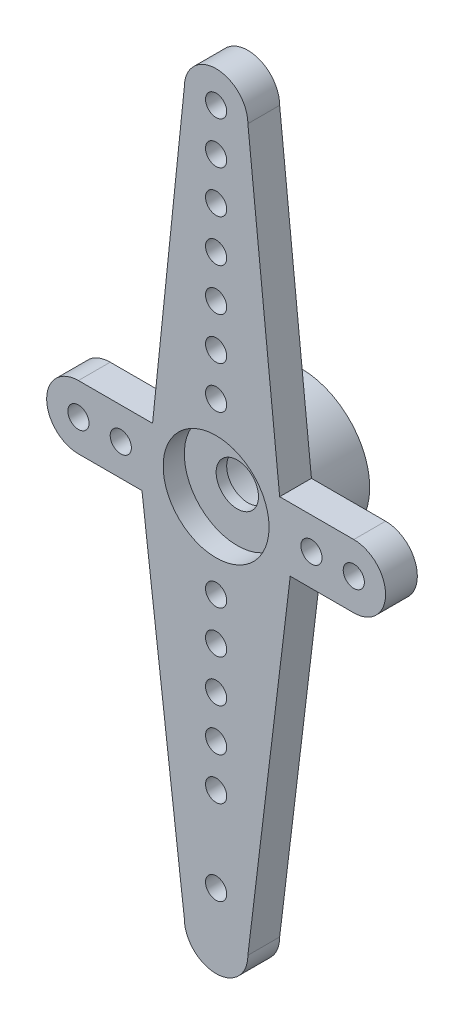
ISO-10303-21;
HEADER;
FILE_DESCRIPTION(('STEP AP214'),'2;1');
FILE_NAME('part.step','',(''),(''),'','','');
FILE_SCHEMA(('AUTOMOTIVE_DESIGN { 1 0 10303 214 1 1 1 1 }'));
ENDSEC;
DATA;
#1=APPLICATION_CONTEXT('core data for automotive mechanical design processes');
#2=APPLICATION_PROTOCOL_DEFINITION('international standard','automotive_design',2000,#1);
#3=PRODUCT_CONTEXT('',#1,'mechanical');
#4=PRODUCT('Part','Part','',(#3));
#5=PRODUCT_RELATED_PRODUCT_CATEGORY('part','',(#4));
#6=PRODUCT_DEFINITION_FORMATION('','',#4);
#7=PRODUCT_DEFINITION_CONTEXT('part definition',#1,'design');
#8=PRODUCT_DEFINITION('design','',#6,#7);
#9=PRODUCT_DEFINITION_SHAPE('','',#8);
#10=(LENGTH_UNIT() NAMED_UNIT(*) SI_UNIT(.MILLI.,.METRE.));
#11=(NAMED_UNIT(*) PLANE_ANGLE_UNIT() SI_UNIT($,.RADIAN.));
#12=(NAMED_UNIT(*) SI_UNIT($,.STERADIAN.) SOLID_ANGLE_UNIT());
#13=UNCERTAINTY_MEASURE_WITH_UNIT(LENGTH_MEASURE(1.E-05),#10,'distance_accuracy_value','');
#14=(GEOMETRIC_REPRESENTATION_CONTEXT(3) GLOBAL_UNCERTAINTY_ASSIGNED_CONTEXT((#13)) GLOBAL_UNIT_ASSIGNED_CONTEXT((#10,
#11,#12)) REPRESENTATION_CONTEXT('',''));
#15=CARTESIAN_POINT('',(0.,0.,0.));
#16=DIRECTION('',(0.,0.,1.));
#17=DIRECTION('',(1.,0.,0.));
#18=AXIS2_PLACEMENT_3D('',#15,#16,#17);
#19=CARTESIAN_POINT('',(0.,0.,1.5));
#20=DIRECTION('',(0.,0.,-1.));
#21=DIRECTION('',(-1.,0.,0.));
#22=AXIS2_PLACEMENT_3D('',#19,#20,#21);
#23=CYLINDRICAL_SURFACE('',#22,1.);
#24=CARTESIAN_POINT('',(0.,0.,0.));
#25=DIRECTION('',(0.,0.,1.));
#26=DIRECTION('',(1.,0.,0.));
#27=AXIS2_PLACEMENT_3D('',#24,#25,#26);
#28=CIRCLE('',#27,1.);
#29=CARTESIAN_POINT('',(1.,0.,0.));
#30=VERTEX_POINT('',#29);
#31=EDGE_CURVE('E728',#30,#30,#28,.T.);
#32=ORIENTED_EDGE('',*,*,#31,.F.);
#33=EDGE_LOOP('',(#32));
#34=FACE_BOUND('',#33,.T.);
#35=CARTESIAN_POINT('',(0.,0.,0.5));
#36=DIRECTION('',(0.,0.,1.));
#37=DIRECTION('',(1.,0.,0.));
#38=AXIS2_PLACEMENT_3D('',#35,#36,#37);
#39=CIRCLE('',#38,1.);
#40=CARTESIAN_POINT('',(1.,0.,0.5));
#41=VERTEX_POINT('',#40);
#42=EDGE_CURVE('E39',#41,#41,#39,.T.);
#43=ORIENTED_EDGE('',*,*,#42,.T.);
#44=EDGE_LOOP('',(#43));
#45=FACE_BOUND('',#44,.T.);
#46=ADVANCED_FACE('F35',(#34,#45),#23,.F.);
#47=CARTESIAN_POINT('',(0.,16.,0.));
#48=DIRECTION('',(0.,0.,1.));
#49=DIRECTION('',(1.,0.,0.));
#50=AXIS2_PLACEMENT_3D('',#47,#48,#49);
#51=PLANE('',#50);
#52=ORIENTED_EDGE('',*,*,#31,.T.);
#53=EDGE_LOOP('',(#52));
#54=FACE_BOUND('',#53,.T.);
#55=CARTESIAN_POINT('',(0.,0.,0.));
#56=DIRECTION('',(0.,0.,-1.));
#57=DIRECTION('',(-1.,0.,0.));
#58=AXIS2_PLACEMENT_3D('',#55,#56,#57);
#59=CIRCLE('',#58,2.);
#60=CARTESIAN_POINT('',(-2.,0.,0.));
#61=VERTEX_POINT('',#60);
#62=EDGE_CURVE('E622',#61,#61,#59,.T.);
#63=ORIENTED_EDGE('',*,*,#62,.T.);
#64=EDGE_LOOP('',(#63));
#65=FACE_BOUND('',#64,.T.);
#66=ADVANCED_FACE('F270',(#54,#65),#51,.F.);
#67=CARTESIAN_POINT('',(0.,16.,1.5));
#68=DIRECTION('',(0.,0.,1.));
#69=DIRECTION('',(1.,0.,0.));
#70=AXIS2_PLACEMENT_3D('',#67,#68,#69);
#71=PLANE('',#70);
#72=CARTESIAN_POINT('',(0.,0.,1.5));
#73=DIRECTION('',(0.,0.,1.));
#74=DIRECTION('',(1.,0.,0.));
#75=AXIS2_PLACEMENT_3D('',#72,#73,#74);
#76=CIRCLE('',#75,2.5);
#77=CARTESIAN_POINT('',(2.5,0.,1.5));
#78=VERTEX_POINT('',#77);
#79=EDGE_CURVE('E620',#78,#78,#76,.T.);
#80=ORIENTED_EDGE('',*,*,#79,.F.);
#81=EDGE_LOOP('',(#80));
#82=FACE_BOUND('',#81,.T.);
#83=CARTESIAN_POINT('',(0.,-10.,1.5));
#84=DIRECTION('',(0.,0.,1.));
#85=DIRECTION('',(-1.,0.,0.));
#86=AXIS2_PLACEMENT_3D('',#83,#84,#85);
#87=CIRCLE('',#86,0.5);
#88=CARTESIAN_POINT('',(-0.499999999999937,-10.,1.5));
#89=VERTEX_POINT('',#88);
#90=EDGE_CURVE('E641',#89,#89,#87,.T.);
#91=ORIENTED_EDGE('',*,*,#90,.F.);
#92=EDGE_LOOP('',(#91));
#93=FACE_BOUND('',#92,.T.);
#94=CARTESIAN_POINT('',(1.04744440165294E-13,-6.,1.5));
#95=DIRECTION('',(0.,0.,1.));
#96=DIRECTION('',(-1.,0.,0.));
#97=AXIS2_PLACEMENT_3D('',#94,#95,#96);
#98=CIRCLE('',#97,0.5);
#99=CARTESIAN_POINT('',(-0.499999999999895,-6.,1.5));
#100=VERTEX_POINT('',#99);
#101=EDGE_CURVE('E653',#100,#100,#98,.T.);
#102=ORIENTED_EDGE('',*,*,#101,.F.);
#103=EDGE_LOOP('',(#102));
#104=FACE_BOUND('',#103,.T.);
#105=CARTESIAN_POINT('',(0.,-16.,1.5));
#106=DIRECTION('',(0.,0.,1.));
#107=DIRECTION('',(-1.,0.,0.));
#108=AXIS2_PLACEMENT_3D('',#105,#106,#107);
#109=CIRCLE('',#108,0.5);
#110=CARTESIAN_POINT('',(-0.5,-16.,1.5));
#111=VERTEX_POINT('',#110);
#112=EDGE_CURVE('E665',#111,#111,#109,.T.);
#113=ORIENTED_EDGE('',*,*,#112,.F.);
#114=EDGE_LOOP('',(#113));
#115=FACE_BOUND('',#114,.T.);
#116=CARTESIAN_POINT('',(1.04744440165294E-13,6.,1.5));
#117=DIRECTION('',(0.,0.,1.));
#118=DIRECTION('',(1.,0.,0.));
#119=AXIS2_PLACEMENT_3D('',#116,#117,#118);
#120=CIRCLE('',#119,0.5);
#121=CARTESIAN_POINT('',(0.500000000000105,6.,1.5));
#122=VERTEX_POINT('',#121);
#123=EDGE_CURVE('E677',#122,#122,#120,.T.);
#124=ORIENTED_EDGE('',*,*,#123,.F.);
#125=EDGE_LOOP('',(#124));
#126=FACE_BOUND('',#125,.T.);
#127=CARTESIAN_POINT('',(0.,10.,1.5));
#128=DIRECTION('',(0.,0.,1.));
#129=DIRECTION('',(1.,0.,0.));
#130=AXIS2_PLACEMENT_3D('',#127,#128,#129);
#131=CIRCLE('',#130,0.5);
#132=CARTESIAN_POINT('',(0.500000000000063,10.,1.5));
#133=VERTEX_POINT('',#132);
#134=EDGE_CURVE('E689',#133,#133,#131,.T.);
#135=ORIENTED_EDGE('',*,*,#134,.F.);
#136=EDGE_LOOP('',(#135));
#137=FACE_BOUND('',#136,.T.);
#138=CARTESIAN_POINT('',(0.,14.,1.5));
#139=DIRECTION('',(0.,0.,1.));
#140=DIRECTION('',(1.,0.,0.));
#141=AXIS2_PLACEMENT_3D('',#138,#139,#140);
#142=CIRCLE('',#141,0.5);
#143=CARTESIAN_POINT('',(0.500000000000021,14.,1.5));
#144=VERTEX_POINT('',#143);
#145=EDGE_CURVE('E701',#144,#144,#142,.T.);
#146=ORIENTED_EDGE('',*,*,#145,.F.);
#147=EDGE_LOOP('',(#146));
#148=FACE_BOUND('',#147,.T.);
#149=CARTESIAN_POINT('',(6.5,0.,1.5));
#150=DIRECTION('',(0.,0.,1.));
#151=DIRECTION('',(-1.,0.,0.));
#152=AXIS2_PLACEMENT_3D('',#149,#150,#151);
#153=CIRCLE('',#152,0.500000000000002);
#154=CARTESIAN_POINT('',(6.,0.,1.5));
#155=VERTEX_POINT('',#154);
#156=EDGE_CURVE('E713',#155,#155,#153,.T.);
#157=ORIENTED_EDGE('',*,*,#156,.F.);
#158=EDGE_LOOP('',(#157));
#159=FACE_BOUND('',#158,.T.);
#160=CARTESIAN_POINT('',(-4.5,0.,1.5));
#161=DIRECTION('',(0.,0.,1.));
#162=DIRECTION('',(1.,0.,0.));
#163=AXIS2_PLACEMENT_3D('',#160,#161,#162);
#164=CIRCLE('',#163,0.500000000000001);
#165=CARTESIAN_POINT('',(-4.,0.,1.5));
#166=VERTEX_POINT('',#165);
#167=EDGE_CURVE('E725',#166,#166,#164,.T.);
#168=ORIENTED_EDGE('',*,*,#167,.F.);
#169=EDGE_LOOP('',(#168));
#170=FACE_BOUND('',#169,.T.);
#171=CARTESIAN_POINT('',(-6.5,0.,1.5));
#172=DIRECTION('',(0.,0.,1.));
#173=DIRECTION('',(1.,0.,0.));
#174=AXIS2_PLACEMENT_3D('',#171,#172,#173);
#175=CIRCLE('',#174,0.500000000000001);
#176=CARTESIAN_POINT('',(-6.,0.,1.5));
#177=VERTEX_POINT('',#176);
#178=EDGE_CURVE('E163',#177,#177,#175,.T.);
#179=ORIENTED_EDGE('',*,*,#178,.F.);
#180=EDGE_LOOP('',(#179));
#181=FACE_BOUND('',#180,.T.);
#182=CARTESIAN_POINT('',(0.,16.,1.5));
#183=DIRECTION('',(0.,0.,1.));
#184=DIRECTION('',(1.,0.,0.));
#185=AXIS2_PLACEMENT_3D('',#182,#183,#184);
#186=CIRCLE('',#185,1.5);
#187=CARTESIAN_POINT('',(1.5,16.,1.5));
#188=VERTEX_POINT('',#187);
#189=CARTESIAN_POINT('',(-1.5,16.,1.5));
#190=VERTEX_POINT('',#189);
#191=EDGE_CURVE('E182',#188,#190,#186,.T.);
#192=ORIENTED_EDGE('',*,*,#191,.T.);
#193=DIRECTION('',(-0.102899151085505,-0.994691793826551,0.));
#194=VECTOR('',#193,1.);
#195=CARTESIAN_POINT('',(-1.5,16.,1.5));
#196=LINE('',#195,#194);
#197=CARTESIAN_POINT('',(-3.,1.5,1.5));
#198=VERTEX_POINT('',#197);
#199=EDGE_CURVE('E109',#190,#198,#196,.T.);
#200=ORIENTED_EDGE('',*,*,#199,.T.);
#201=DIRECTION('',(-1.,0.,0.));
#202=VECTOR('',#201,1.);
#203=CARTESIAN_POINT('',(-3.,1.5,1.5));
#204=LINE('',#203,#202);
#205=CARTESIAN_POINT('',(-6.5,1.5,1.5));
#206=VERTEX_POINT('',#205);
#207=EDGE_CURVE('E229',#198,#206,#204,.T.);
#208=ORIENTED_EDGE('',*,*,#207,.T.);
#209=CARTESIAN_POINT('',(-6.5,0.,1.5));
#210=DIRECTION('',(0.,0.,1.));
#211=DIRECTION('',(-1.,0.,0.));
#212=AXIS2_PLACEMENT_3D('',#209,#210,#211);
#213=CIRCLE('',#212,1.5);
#214=CARTESIAN_POINT('',(-6.5,-1.5,1.5));
#215=VERTEX_POINT('',#214);
#216=EDGE_CURVE('E226',#206,#215,#213,.T.);
#217=ORIENTED_EDGE('',*,*,#216,.T.);
#218=DIRECTION('',(1.,0.,0.));
#219=VECTOR('',#218,1.);
#220=CARTESIAN_POINT('',(-6.5,-1.5,1.5));
#221=LINE('',#220,#219);
#222=CARTESIAN_POINT('',(-3.5,-1.5,1.5));
#223=VERTEX_POINT('',#222);
#224=EDGE_CURVE('E228',#215,#223,#221,.T.);
#225=ORIENTED_EDGE('',*,*,#224,.T.);
#226=DIRECTION('',(0.120331367519237,-0.992733782033708,0.));
#227=VECTOR('',#226,1.);
#228=CARTESIAN_POINT('',(-3.5,-1.5,1.5));
#229=LINE('',#228,#227);
#230=CARTESIAN_POINT('',(-1.5,-18.,1.5));
#231=VERTEX_POINT('',#230);
#232=EDGE_CURVE('E231',#223,#231,#229,.T.);
#233=ORIENTED_EDGE('',*,*,#232,.T.);
#234=CARTESIAN_POINT('',(0.,-18.,1.5));
#235=DIRECTION('',(0.,0.,1.));
#236=DIRECTION('',(1.,0.,0.));
#237=AXIS2_PLACEMENT_3D('',#234,#235,#236);
#238=CIRCLE('',#237,1.5);
#239=CARTESIAN_POINT('',(1.5,-18.,1.5));
#240=VERTEX_POINT('',#239);
#241=EDGE_CURVE('E237',#231,#240,#238,.T.);
#242=ORIENTED_EDGE('',*,*,#241,.T.);
#243=DIRECTION('',(0.120331367519237,0.992733782033708,0.));
#244=VECTOR('',#243,1.);
#245=CARTESIAN_POINT('',(3.5,-1.5,1.5));
#246=LINE('',#245,#244);
#247=CARTESIAN_POINT('',(3.5,-1.5,1.5));
#248=VERTEX_POINT('',#247);
#249=EDGE_CURVE('E239',#240,#248,#246,.T.);
#250=ORIENTED_EDGE('',*,*,#249,.T.);
#251=DIRECTION('',(1.,0.,0.));
#252=VECTOR('',#251,1.);
#253=CARTESIAN_POINT('',(6.5,-1.5,1.5));
#254=LINE('',#253,#252);
#255=CARTESIAN_POINT('',(6.5,-1.5,1.5));
#256=VERTEX_POINT('',#255);
#257=EDGE_CURVE('E141',#248,#256,#254,.T.);
#258=ORIENTED_EDGE('',*,*,#257,.T.);
#259=CARTESIAN_POINT('',(6.5,0.,1.5));
#260=DIRECTION('',(0.,0.,1.));
#261=DIRECTION('',(1.,0.,0.));
#262=AXIS2_PLACEMENT_3D('',#259,#260,#261);
#263=CIRCLE('',#262,1.5);
#264=CARTESIAN_POINT('',(6.5,1.5,1.5));
#265=VERTEX_POINT('',#264);
#266=EDGE_CURVE('E134',#256,#265,#263,.T.);
#267=ORIENTED_EDGE('',*,*,#266,.T.);
#268=DIRECTION('',(-1.,0.,0.));
#269=VECTOR('',#268,1.);
#270=CARTESIAN_POINT('',(3.,1.5,1.5));
#271=LINE('',#270,#269);
#272=CARTESIAN_POINT('',(3.,1.5,1.5));
#273=VERTEX_POINT('',#272);
#274=EDGE_CURVE('E139',#265,#273,#271,.T.);
#275=ORIENTED_EDGE('',*,*,#274,.T.);
#276=DIRECTION('',(-0.102899151085505,0.994691793826551,0.));
#277=VECTOR('',#276,1.);
#278=CARTESIAN_POINT('',(1.5,16.,1.5));
#279=LINE('',#278,#277);
#280=EDGE_CURVE('E53',#273,#188,#279,.T.);
#281=ORIENTED_EDGE('',*,*,#280,.T.);
#282=EDGE_LOOP('',(#192,#200,#208,#217,#225,#233,#242,#250,#258,#267,#275,#281));
#283=FACE_BOUND('',#282,.T.);
#284=CARTESIAN_POINT('',(4.5,0.,1.5));
#285=DIRECTION('',(0.,0.,1.));
#286=DIRECTION('',(-1.,0.,0.));
#287=AXIS2_PLACEMENT_3D('',#284,#285,#286);
#288=CIRCLE('',#287,0.500000000000001);
#289=CARTESIAN_POINT('',(4.,0.,1.5));
#290=VERTEX_POINT('',#289);
#291=EDGE_CURVE('E719',#290,#290,#288,.T.);
#292=ORIENTED_EDGE('',*,*,#291,.F.);
#293=EDGE_LOOP('',(#292));
#294=FACE_BOUND('',#293,.T.);
#295=CARTESIAN_POINT('',(0.,16.,1.5));
#296=DIRECTION('',(0.,0.,1.));
#297=DIRECTION('',(1.,0.,0.));
#298=AXIS2_PLACEMENT_3D('',#295,#296,#297);
#299=CIRCLE('',#298,0.5);
#300=CARTESIAN_POINT('',(0.5,16.,1.5));
#301=VERTEX_POINT('',#300);
#302=EDGE_CURVE('E707',#301,#301,#299,.T.);
#303=ORIENTED_EDGE('',*,*,#302,.F.);
#304=EDGE_LOOP('',(#303));
#305=FACE_BOUND('',#304,.T.);
#306=CARTESIAN_POINT('',(0.,12.,1.5));
#307=DIRECTION('',(0.,0.,1.));
#308=DIRECTION('',(1.,0.,0.));
#309=AXIS2_PLACEMENT_3D('',#306,#307,#308);
#310=CIRCLE('',#309,0.5);
#311=CARTESIAN_POINT('',(0.500000000000042,12.,1.5));
#312=VERTEX_POINT('',#311);
#313=EDGE_CURVE('E695',#312,#312,#310,.T.);
#314=ORIENTED_EDGE('',*,*,#313,.F.);
#315=EDGE_LOOP('',(#314));
#316=FACE_BOUND('',#315,.T.);
#317=CARTESIAN_POINT('',(0.,8.,1.5));
#318=DIRECTION('',(0.,0.,1.));
#319=DIRECTION('',(1.,0.,0.));
#320=AXIS2_PLACEMENT_3D('',#317,#318,#319);
#321=CIRCLE('',#320,0.5);
#322=CARTESIAN_POINT('',(0.500000000000084,8.,1.5));
#323=VERTEX_POINT('',#322);
#324=EDGE_CURVE('E683',#323,#323,#321,.T.);
#325=ORIENTED_EDGE('',*,*,#324,.F.);
#326=EDGE_LOOP('',(#325));
#327=FACE_BOUND('',#326,.T.);
#328=CARTESIAN_POINT('',(1.25693328198353E-13,4.,1.5));
#329=DIRECTION('',(0.,0.,1.));
#330=DIRECTION('',(1.,0.,0.));
#331=AXIS2_PLACEMENT_3D('',#328,#329,#330);
#332=CIRCLE('',#331,0.5);
#333=CARTESIAN_POINT('',(0.500000000000126,4.,1.5));
#334=VERTEX_POINT('',#333);
#335=EDGE_CURVE('E671',#334,#334,#332,.T.);
#336=ORIENTED_EDGE('',*,*,#335,.F.);
#337=EDGE_LOOP('',(#336));
#338=FACE_BOUND('',#337,.T.);
#339=CARTESIAN_POINT('',(1.25693328198353E-13,-4.,1.5));
#340=DIRECTION('',(0.,0.,1.));
#341=DIRECTION('',(-1.,0.,0.));
#342=AXIS2_PLACEMENT_3D('',#339,#340,#341);
#343=CIRCLE('',#342,0.5);
#344=CARTESIAN_POINT('',(-0.499999999999874,-4.,1.5));
#345=VERTEX_POINT('',#344);
#346=EDGE_CURVE('E659',#345,#345,#343,.T.);
#347=ORIENTED_EDGE('',*,*,#346,.F.);
#348=EDGE_LOOP('',(#347));
#349=FACE_BOUND('',#348,.T.);
#350=CARTESIAN_POINT('',(0.,-8.,1.5));
#351=DIRECTION('',(0.,0.,1.));
#352=DIRECTION('',(-1.,0.,0.));
#353=AXIS2_PLACEMENT_3D('',#350,#351,#352);
#354=CIRCLE('',#353,0.5);
#355=CARTESIAN_POINT('',(-0.499999999999916,-8.,1.5));
#356=VERTEX_POINT('',#355);
#357=EDGE_CURVE('E647',#356,#356,#354,.T.);
#358=ORIENTED_EDGE('',*,*,#357,.F.);
#359=EDGE_LOOP('',(#358));
#360=FACE_BOUND('',#359,.T.);
#361=CARTESIAN_POINT('',(0.,-12.,1.5));
#362=DIRECTION('',(0.,0.,1.));
#363=DIRECTION('',(-1.,0.,0.));
#364=AXIS2_PLACEMENT_3D('',#361,#362,#363);
#365=CIRCLE('',#364,0.5);
#366=CARTESIAN_POINT('',(-0.499999999999958,-12.,1.5));
#367=VERTEX_POINT('',#366);
#368=EDGE_CURVE('E635',#367,#367,#365,.T.);
#369=ORIENTED_EDGE('',*,*,#368,.F.);
#370=EDGE_LOOP('',(#369));
#371=FACE_BOUND('',#370,.T.);
#372=ADVANCED_FACE('F136',(#82,#93,#104,#115,#126,#137,#148,#159,#170,#181,#283,#294,#305,#316,
#327,#338,#349,#360,#371),#71,.T.);
#373=CARTESIAN_POINT('',(0.,0.,0.));
#374=DIRECTION('',(0.,0.,1.));
#375=DIRECTION('',(1.,0.,0.));
#376=AXIS2_PLACEMENT_3D('',#373,#374,#375);
#377=CIRCLE('',#376,3.25);
#378=CARTESIAN_POINT('',(3.25,0.,0.));
#379=VERTEX_POINT('',#378);
#380=EDGE_CURVE('E11',#379,#379,#377,.F.);
#381=ORIENTED_EDGE('',*,*,#380,.F.);
#382=EDGE_LOOP('',(#381));
#383=FACE_BOUND('',#382,.T.);
#384=CARTESIAN_POINT('',(0.,16.,0.));
#385=DIRECTION('',(0.,0.,1.));
#386=DIRECTION('',(1.,0.,0.));
#387=AXIS2_PLACEMENT_3D('',#384,#385,#386);
#388=CIRCLE('',#387,1.5);
#389=CARTESIAN_POINT('',(1.5,16.,0.));
#390=VERTEX_POINT('',#389);
#391=CARTESIAN_POINT('',(-1.5,16.,0.));
#392=VERTEX_POINT('',#391);
#393=EDGE_CURVE('E159',#390,#392,#388,.T.);
#394=ORIENTED_EDGE('',*,*,#393,.F.);
#395=DIRECTION('',(-0.102899151085505,0.994691793826551,0.));
#396=VECTOR('',#395,1.);
#397=CARTESIAN_POINT('',(1.5,16.,0.));
#398=LINE('',#397,#396);
#399=CARTESIAN_POINT('',(3.,1.5,0.));
#400=VERTEX_POINT('',#399);
#401=EDGE_CURVE('E100',#400,#390,#398,.T.);
#402=ORIENTED_EDGE('',*,*,#401,.F.);
#403=DIRECTION('',(-1.,0.,0.));
#404=VECTOR('',#403,1.);
#405=CARTESIAN_POINT('',(3.,1.5,0.));
#406=LINE('',#405,#404);
#407=CARTESIAN_POINT('',(6.5,1.5,0.));
#408=VERTEX_POINT('',#407);
#409=EDGE_CURVE('E94',#408,#400,#406,.T.);
#410=ORIENTED_EDGE('',*,*,#409,.F.);
#411=CARTESIAN_POINT('',(6.5,0.,0.));
#412=DIRECTION('',(0.,0.,1.));
#413=DIRECTION('',(1.,0.,0.));
#414=AXIS2_PLACEMENT_3D('',#411,#412,#413);
#415=CIRCLE('',#414,1.5);
#416=CARTESIAN_POINT('',(6.5,-1.5,0.));
#417=VERTEX_POINT('',#416);
#418=EDGE_CURVE('E149',#417,#408,#415,.T.);
#419=ORIENTED_EDGE('',*,*,#418,.F.);
#420=DIRECTION('',(1.,0.,0.));
#421=VECTOR('',#420,1.);
#422=CARTESIAN_POINT('',(6.5,-1.5,0.));
#423=LINE('',#422,#421);
#424=CARTESIAN_POINT('',(3.5,-1.5,0.));
#425=VERTEX_POINT('',#424);
#426=EDGE_CURVE('E177',#425,#417,#423,.T.);
#427=ORIENTED_EDGE('',*,*,#426,.F.);
#428=DIRECTION('',(0.120331367519237,0.992733782033708,0.));
#429=VECTOR('',#428,1.);
#430=CARTESIAN_POINT('',(3.5,-1.5,0.));
#431=LINE('',#430,#429);
#432=CARTESIAN_POINT('',(1.5,-18.,0.));
#433=VERTEX_POINT('',#432);
#434=EDGE_CURVE('E175',#433,#425,#431,.T.);
#435=ORIENTED_EDGE('',*,*,#434,.F.);
#436=CARTESIAN_POINT('',(0.,-18.,0.));
#437=DIRECTION('',(0.,0.,1.));
#438=DIRECTION('',(1.,0.,0.));
#439=AXIS2_PLACEMENT_3D('',#436,#437,#438);
#440=CIRCLE('',#439,1.5);
#441=CARTESIAN_POINT('',(-1.5,-18.,0.));
#442=VERTEX_POINT('',#441);
#443=EDGE_CURVE('E173',#442,#433,#440,.T.);
#444=ORIENTED_EDGE('',*,*,#443,.F.);
#445=DIRECTION('',(0.120331367519237,-0.992733782033708,0.));
#446=VECTOR('',#445,1.);
#447=CARTESIAN_POINT('',(-3.5,-1.5,0.));
#448=LINE('',#447,#446);
#449=CARTESIAN_POINT('',(-3.5,-1.5,0.));
#450=VERTEX_POINT('',#449);
#451=EDGE_CURVE('E171',#450,#442,#448,.T.);
#452=ORIENTED_EDGE('',*,*,#451,.F.);
#453=DIRECTION('',(1.,0.,0.));
#454=VECTOR('',#453,1.);
#455=CARTESIAN_POINT('',(-6.5,-1.5,0.));
#456=LINE('',#455,#454);
#457=CARTESIAN_POINT('',(-6.5,-1.5,0.));
#458=VERTEX_POINT('',#457);
#459=EDGE_CURVE('E169',#458,#450,#456,.T.);
#460=ORIENTED_EDGE('',*,*,#459,.F.);
#461=CARTESIAN_POINT('',(-6.5,0.,0.));
#462=DIRECTION('',(0.,0.,1.));
#463=DIRECTION('',(-1.,0.,0.));
#464=AXIS2_PLACEMENT_3D('',#461,#462,#463);
#465=CIRCLE('',#464,1.5);
#466=CARTESIAN_POINT('',(-6.5,1.5,0.));
#467=VERTEX_POINT('',#466);
#468=EDGE_CURVE('E167',#467,#458,#465,.T.);
#469=ORIENTED_EDGE('',*,*,#468,.F.);
#470=DIRECTION('',(-1.,0.,0.));
#471=VECTOR('',#470,1.);
#472=CARTESIAN_POINT('',(-3.,1.5,0.));
#473=LINE('',#472,#471);
#474=CARTESIAN_POINT('',(-3.,1.5,0.));
#475=VERTEX_POINT('',#474);
#476=EDGE_CURVE('E165',#475,#467,#473,.T.);
#477=ORIENTED_EDGE('',*,*,#476,.F.);
#478=DIRECTION('',(-0.102899151085505,-0.994691793826551,0.));
#479=VECTOR('',#478,1.);
#480=CARTESIAN_POINT('',(-1.5,16.,0.));
#481=LINE('',#480,#479);
#482=EDGE_CURVE('E162',#392,#475,#481,.T.);
#483=ORIENTED_EDGE('',*,*,#482,.F.);
#484=EDGE_LOOP('',(#394,#402,#410,#419,#427,#435,#444,#452,#460,#469,#477,#483));
#485=FACE_BOUND('',#484,.T.);
#486=CARTESIAN_POINT('',(-6.5,0.,0.));
#487=DIRECTION('',(0.,0.,1.));
#488=DIRECTION('',(1.,0.,0.));
#489=AXIS2_PLACEMENT_3D('',#486,#487,#488);
#490=CIRCLE('',#489,0.500000000000001);
#491=CARTESIAN_POINT('',(-6.,0.,0.));
#492=VERTEX_POINT('',#491);
#493=EDGE_CURVE('E733',#492,#492,#490,.T.);
#494=ORIENTED_EDGE('',*,*,#493,.T.);
#495=EDGE_LOOP('',(#494));
#496=FACE_BOUND('',#495,.T.);
#497=CARTESIAN_POINT('',(-4.5,0.,0.));
#498=DIRECTION('',(0.,0.,1.));
#499=DIRECTION('',(1.,0.,0.));
#500=AXIS2_PLACEMENT_3D('',#497,#498,#499);
#501=CIRCLE('',#500,0.500000000000001);
#502=CARTESIAN_POINT('',(-4.,0.,0.));
#503=VERTEX_POINT('',#502);
#504=EDGE_CURVE('E722',#503,#503,#501,.T.);
#505=ORIENTED_EDGE('',*,*,#504,.T.);
#506=EDGE_LOOP('',(#505));
#507=FACE_BOUND('',#506,.T.);
#508=CARTESIAN_POINT('',(4.5,0.,0.));
#509=DIRECTION('',(0.,0.,1.));
#510=DIRECTION('',(-1.,0.,0.));
#511=AXIS2_PLACEMENT_3D('',#508,#509,#510);
#512=CIRCLE('',#511,0.500000000000001);
#513=CARTESIAN_POINT('',(4.,0.,0.));
#514=VERTEX_POINT('',#513);
#515=EDGE_CURVE('E716',#514,#514,#512,.T.);
#516=ORIENTED_EDGE('',*,*,#515,.T.);
#517=EDGE_LOOP('',(#516));
#518=FACE_BOUND('',#517,.T.);
#519=CARTESIAN_POINT('',(6.5,0.,0.));
#520=DIRECTION('',(0.,0.,1.));
#521=DIRECTION('',(-1.,0.,0.));
#522=AXIS2_PLACEMENT_3D('',#519,#520,#521);
#523=CIRCLE('',#522,0.500000000000002);
#524=CARTESIAN_POINT('',(6.,0.,0.));
#525=VERTEX_POINT('',#524);
#526=EDGE_CURVE('E710',#525,#525,#523,.T.);
#527=ORIENTED_EDGE('',*,*,#526,.T.);
#528=EDGE_LOOP('',(#527));
#529=FACE_BOUND('',#528,.T.);
#530=CARTESIAN_POINT('',(0.,16.,0.));
#531=DIRECTION('',(0.,0.,1.));
#532=DIRECTION('',(1.,0.,0.));
#533=AXIS2_PLACEMENT_3D('',#530,#531,#532);
#534=CIRCLE('',#533,0.5);
#535=CARTESIAN_POINT('',(0.5,16.,0.));
#536=VERTEX_POINT('',#535);
#537=EDGE_CURVE('E704',#536,#536,#534,.T.);
#538=ORIENTED_EDGE('',*,*,#537,.T.);
#539=EDGE_LOOP('',(#538));
#540=FACE_BOUND('',#539,.T.);
#541=CARTESIAN_POINT('',(0.,14.,0.));
#542=DIRECTION('',(0.,0.,1.));
#543=DIRECTION('',(1.,0.,0.));
#544=AXIS2_PLACEMENT_3D('',#541,#542,#543);
#545=CIRCLE('',#544,0.5);
#546=CARTESIAN_POINT('',(0.500000000000021,14.,0.));
#547=VERTEX_POINT('',#546);
#548=EDGE_CURVE('E698',#547,#547,#545,.T.);
#549=ORIENTED_EDGE('',*,*,#548,.T.);
#550=EDGE_LOOP('',(#549));
#551=FACE_BOUND('',#550,.T.);
#552=CARTESIAN_POINT('',(0.,12.,0.));
#553=DIRECTION('',(0.,0.,1.));
#554=DIRECTION('',(1.,0.,0.));
#555=AXIS2_PLACEMENT_3D('',#552,#553,#554);
#556=CIRCLE('',#555,0.5);
#557=CARTESIAN_POINT('',(0.500000000000042,12.,0.));
#558=VERTEX_POINT('',#557);
#559=EDGE_CURVE('E692',#558,#558,#556,.T.);
#560=ORIENTED_EDGE('',*,*,#559,.T.);
#561=EDGE_LOOP('',(#560));
#562=FACE_BOUND('',#561,.T.);
#563=CARTESIAN_POINT('',(0.,10.,0.));
#564=DIRECTION('',(0.,0.,1.));
#565=DIRECTION('',(1.,0.,0.));
#566=AXIS2_PLACEMENT_3D('',#563,#564,#565);
#567=CIRCLE('',#566,0.5);
#568=CARTESIAN_POINT('',(0.500000000000063,10.,0.));
#569=VERTEX_POINT('',#568);
#570=EDGE_CURVE('E686',#569,#569,#567,.T.);
#571=ORIENTED_EDGE('',*,*,#570,.T.);
#572=EDGE_LOOP('',(#571));
#573=FACE_BOUND('',#572,.T.);
#574=CARTESIAN_POINT('',(0.,8.,0.));
#575=DIRECTION('',(0.,0.,1.));
#576=DIRECTION('',(1.,0.,0.));
#577=AXIS2_PLACEMENT_3D('',#574,#575,#576);
#578=CIRCLE('',#577,0.5);
#579=CARTESIAN_POINT('',(0.500000000000084,8.,0.));
#580=VERTEX_POINT('',#579);
#581=EDGE_CURVE('E680',#580,#580,#578,.T.);
#582=ORIENTED_EDGE('',*,*,#581,.T.);
#583=EDGE_LOOP('',(#582));
#584=FACE_BOUND('',#583,.T.);
#585=CARTESIAN_POINT('',(1.04744440165294E-13,6.,0.));
#586=DIRECTION('',(0.,0.,1.));
#587=DIRECTION('',(1.,0.,0.));
#588=AXIS2_PLACEMENT_3D('',#585,#586,#587);
#589=CIRCLE('',#588,0.5);
#590=CARTESIAN_POINT('',(0.500000000000105,6.,0.));
#591=VERTEX_POINT('',#590);
#592=EDGE_CURVE('E674',#591,#591,#589,.T.);
#593=ORIENTED_EDGE('',*,*,#592,.T.);
#594=EDGE_LOOP('',(#593));
#595=FACE_BOUND('',#594,.T.);
#596=CARTESIAN_POINT('',(1.25693328198353E-13,4.,0.));
#597=DIRECTION('',(0.,0.,1.));
#598=DIRECTION('',(1.,0.,0.));
#599=AXIS2_PLACEMENT_3D('',#596,#597,#598);
#600=CIRCLE('',#599,0.5);
#601=CARTESIAN_POINT('',(0.500000000000126,4.,0.));
#602=VERTEX_POINT('',#601);
#603=EDGE_CURVE('E668',#602,#602,#600,.T.);
#604=ORIENTED_EDGE('',*,*,#603,.T.);
#605=EDGE_LOOP('',(#604));
#606=FACE_BOUND('',#605,.T.);
#607=CARTESIAN_POINT('',(0.,-16.,0.));
#608=DIRECTION('',(0.,0.,1.));
#609=DIRECTION('',(-1.,0.,0.));
#610=AXIS2_PLACEMENT_3D('',#607,#608,#609);
#611=CIRCLE('',#610,0.5);
#612=CARTESIAN_POINT('',(-0.5,-16.,0.));
#613=VERTEX_POINT('',#612);
#614=EDGE_CURVE('E662',#613,#613,#611,.T.);
#615=ORIENTED_EDGE('',*,*,#614,.T.);
#616=EDGE_LOOP('',(#615));
#617=FACE_BOUND('',#616,.T.);
#618=CARTESIAN_POINT('',(1.25693328198353E-13,-4.,0.));
#619=DIRECTION('',(0.,0.,1.));
#620=DIRECTION('',(-1.,0.,0.));
#621=AXIS2_PLACEMENT_3D('',#618,#619,#620);
#622=CIRCLE('',#621,0.5);
#623=CARTESIAN_POINT('',(-0.499999999999874,-4.,0.));
#624=VERTEX_POINT('',#623);
#625=EDGE_CURVE('E656',#624,#624,#622,.T.);
#626=ORIENTED_EDGE('',*,*,#625,.T.);
#627=EDGE_LOOP('',(#626));
#628=FACE_BOUND('',#627,.T.);
#629=CARTESIAN_POINT('',(1.04744440165294E-13,-6.,0.));
#630=DIRECTION('',(0.,0.,1.));
#631=DIRECTION('',(-1.,0.,0.));
#632=AXIS2_PLACEMENT_3D('',#629,#630,#631);
#633=CIRCLE('',#632,0.5);
#634=CARTESIAN_POINT('',(-0.499999999999895,-6.,0.));
#635=VERTEX_POINT('',#634);
#636=EDGE_CURVE('E650',#635,#635,#633,.T.);
#637=ORIENTED_EDGE('',*,*,#636,.T.);
#638=EDGE_LOOP('',(#637));
#639=FACE_BOUND('',#638,.T.);
#640=CARTESIAN_POINT('',(0.,-8.,0.));
#641=DIRECTION('',(0.,0.,1.));
#642=DIRECTION('',(-1.,0.,0.));
#643=AXIS2_PLACEMENT_3D('',#640,#641,#642);
#644=CIRCLE('',#643,0.5);
#645=CARTESIAN_POINT('',(-0.499999999999916,-8.,0.));
#646=VERTEX_POINT('',#645);
#647=EDGE_CURVE('E644',#646,#646,#644,.T.);
#648=ORIENTED_EDGE('',*,*,#647,.T.);
#649=EDGE_LOOP('',(#648));
#650=FACE_BOUND('',#649,.T.);
#651=CARTESIAN_POINT('',(0.,-10.,0.));
#652=DIRECTION('',(0.,0.,1.));
#653=DIRECTION('',(-1.,0.,0.));
#654=AXIS2_PLACEMENT_3D('',#651,#652,#653);
#655=CIRCLE('',#654,0.5);
#656=CARTESIAN_POINT('',(-0.499999999999937,-10.,0.));
#657=VERTEX_POINT('',#656);
#658=EDGE_CURVE('E638',#657,#657,#655,.T.);
#659=ORIENTED_EDGE('',*,*,#658,.T.);
#660=EDGE_LOOP('',(#659));
#661=FACE_BOUND('',#660,.T.);
#662=CARTESIAN_POINT('',(0.,-12.,0.));
#663=DIRECTION('',(0.,0.,1.));
#664=DIRECTION('',(-1.,0.,0.));
#665=AXIS2_PLACEMENT_3D('',#662,#663,#664);
#666=CIRCLE('',#665,0.5);
#667=CARTESIAN_POINT('',(-0.499999999999958,-12.,0.));
#668=VERTEX_POINT('',#667);
#669=EDGE_CURVE('E634',#668,#668,#666,.T.);
#670=ORIENTED_EDGE('',*,*,#669,.T.);
#671=EDGE_LOOP('',(#670));
#672=FACE_BOUND('',#671,.T.);
#673=ADVANCED_FACE('F213',(#383,#485,#496,#507,#518,#529,#540,#551,#562,#573,#584,#595,#606,
#617,#628,#639,#650,#661,#672),#51,.F.);
#674=CARTESIAN_POINT('',(0.,16.,1.5));
#675=DIRECTION('',(0.,0.,-1.));
#676=DIRECTION('',(-1.,0.,0.));
#677=AXIS2_PLACEMENT_3D('',#674,#675,#676);
#678=CYLINDRICAL_SURFACE('',#677,1.5);
#679=ORIENTED_EDGE('',*,*,#393,.T.);
#680=DIRECTION('',(0.,0.,-1.));
#681=VECTOR('',#680,1.);
#682=CARTESIAN_POINT('',(-1.5,16.,1.5));
#683=LINE('',#682,#681);
#684=EDGE_CURVE('E45',#190,#392,#683,.T.);
#685=ORIENTED_EDGE('',*,*,#684,.F.);
#686=ORIENTED_EDGE('',*,*,#191,.F.);
#687=DIRECTION('',(0.,0.,-1.));
#688=VECTOR('',#687,1.);
#689=CARTESIAN_POINT('',(1.5,16.,1.5));
#690=LINE('',#689,#688);
#691=EDGE_CURVE('E155',#188,#390,#690,.T.);
#692=ORIENTED_EDGE('',*,*,#691,.T.);
#693=EDGE_LOOP('',(#679,#685,#686,#692));
#694=FACE_BOUND('',#693,.T.);
#695=ADVANCED_FACE('F37',(#694),#678,.T.);
#696=CARTESIAN_POINT('',(-1.5,16.,1.5));
#697=DIRECTION('',(0.994691793826551,-0.102899151085505,0.));
#698=DIRECTION('',(0.102899151085505,0.994691793826551,0.));
#699=AXIS2_PLACEMENT_3D('',#696,#697,#698);
#700=PLANE('',#699);
#701=ORIENTED_EDGE('',*,*,#482,.T.);
#702=DIRECTION('',(0.,0.,-1.));
#703=VECTOR('',#702,1.);
#704=CARTESIAN_POINT('',(-3.,1.5,1.5));
#705=LINE('',#704,#703);
#706=EDGE_CURVE('E204',#198,#475,#705,.T.);
#707=ORIENTED_EDGE('',*,*,#706,.F.);
#708=ORIENTED_EDGE('',*,*,#199,.F.);
#709=ORIENTED_EDGE('',*,*,#684,.T.);
#710=EDGE_LOOP('',(#701,#707,#708,#709));
#711=FACE_BOUND('',#710,.T.);
#712=ADVANCED_FACE('F208',(#711),#700,.F.);
#713=CARTESIAN_POINT('',(-3.,1.5,1.5));
#714=DIRECTION('',(0.,-1.,0.));
#715=DIRECTION('',(1.,0.,0.));
#716=AXIS2_PLACEMENT_3D('',#713,#714,#715);
#717=PLANE('',#716);
#718=ORIENTED_EDGE('',*,*,#476,.T.);
#719=DIRECTION('',(0.,0.,-1.));
#720=VECTOR('',#719,1.);
#721=CARTESIAN_POINT('',(-6.5,1.5,1.5));
#722=LINE('',#721,#720);
#723=EDGE_CURVE('E201',#206,#467,#722,.T.);
#724=ORIENTED_EDGE('',*,*,#723,.F.);
#725=ORIENTED_EDGE('',*,*,#207,.F.);
#726=ORIENTED_EDGE('',*,*,#706,.T.);
#727=EDGE_LOOP('',(#718,#724,#725,#726));
#728=FACE_BOUND('',#727,.T.);
#729=ADVANCED_FACE('F220',(#728),#717,.F.);
#730=CARTESIAN_POINT('',(-6.5,0.,1.5));
#731=DIRECTION('',(0.,0.,-1.));
#732=DIRECTION('',(-1.,0.,0.));
#733=AXIS2_PLACEMENT_3D('',#730,#731,#732);
#734=CYLINDRICAL_SURFACE('',#733,1.5);
#735=ORIENTED_EDGE('',*,*,#468,.T.);
#736=DIRECTION('',(0.,0.,-1.));
#737=VECTOR('',#736,1.);
#738=CARTESIAN_POINT('',(-6.5,-1.5,1.5));
#739=LINE('',#738,#737);
#740=EDGE_CURVE('E198',#215,#458,#739,.T.);
#741=ORIENTED_EDGE('',*,*,#740,.F.);
#742=ORIENTED_EDGE('',*,*,#216,.F.);
#743=ORIENTED_EDGE('',*,*,#723,.T.);
#744=EDGE_LOOP('',(#735,#741,#742,#743));
#745=FACE_BOUND('',#744,.T.);
#746=ADVANCED_FACE('F224',(#745),#734,.T.);
#747=CARTESIAN_POINT('',(-6.5,-1.5,1.5));
#748=DIRECTION('',(0.,1.,0.));
#749=DIRECTION('',(-1.,0.,0.));
#750=AXIS2_PLACEMENT_3D('',#747,#748,#749);
#751=PLANE('',#750);
#752=ORIENTED_EDGE('',*,*,#459,.T.);
#753=DIRECTION('',(0.,0.,-1.));
#754=VECTOR('',#753,1.);
#755=CARTESIAN_POINT('',(-3.5,-1.5,1.5));
#756=LINE('',#755,#754);
#757=EDGE_CURVE('E195',#223,#450,#756,.T.);
#758=ORIENTED_EDGE('',*,*,#757,.F.);
#759=ORIENTED_EDGE('',*,*,#224,.F.);
#760=ORIENTED_EDGE('',*,*,#740,.T.);
#761=EDGE_LOOP('',(#752,#758,#759,#760));
#762=FACE_BOUND('',#761,.T.);
#763=ADVANCED_FACE('F260',(#762),#751,.F.);
#764=CARTESIAN_POINT('',(-3.5,-1.5,1.5));
#765=DIRECTION('',(0.992733782033708,0.120331367519237,0.));
#766=DIRECTION('',(-0.120331367519237,0.992733782033708,0.));
#767=AXIS2_PLACEMENT_3D('',#764,#765,#766);
#768=PLANE('',#767);
#769=ORIENTED_EDGE('',*,*,#451,.T.);
#770=DIRECTION('',(0.,0.,-1.));
#771=VECTOR('',#770,1.);
#772=CARTESIAN_POINT('',(-1.5,-18.,1.5));
#773=LINE('',#772,#771);
#774=EDGE_CURVE('E192',#231,#442,#773,.T.);
#775=ORIENTED_EDGE('',*,*,#774,.F.);
#776=ORIENTED_EDGE('',*,*,#232,.F.);
#777=ORIENTED_EDGE('',*,*,#757,.T.);
#778=EDGE_LOOP('',(#769,#775,#776,#777));
#779=FACE_BOUND('',#778,.T.);
#780=ADVANCED_FACE('F257',(#779),#768,.F.);
#781=CARTESIAN_POINT('',(0.,-18.,1.5));
#782=DIRECTION('',(0.,0.,-1.));
#783=DIRECTION('',(-1.,0.,0.));
#784=AXIS2_PLACEMENT_3D('',#781,#782,#783);
#785=CYLINDRICAL_SURFACE('',#784,1.5);
#786=ORIENTED_EDGE('',*,*,#443,.T.);
#787=DIRECTION('',(0.,0.,-1.));
#788=VECTOR('',#787,1.);
#789=CARTESIAN_POINT('',(1.5,-18.,1.5));
#790=LINE('',#789,#788);
#791=EDGE_CURVE('E189',#240,#433,#790,.T.);
#792=ORIENTED_EDGE('',*,*,#791,.F.);
#793=ORIENTED_EDGE('',*,*,#241,.F.);
#794=ORIENTED_EDGE('',*,*,#774,.T.);
#795=EDGE_LOOP('',(#786,#792,#793,#794));
#796=FACE_BOUND('',#795,.T.);
#797=ADVANCED_FACE('F253',(#796),#785,.T.);
#798=CARTESIAN_POINT('',(3.5,-1.5,1.5));
#799=DIRECTION('',(-0.992733782033708,0.120331367519237,0.));
#800=DIRECTION('',(-0.120331367519237,-0.992733782033708,0.));
#801=AXIS2_PLACEMENT_3D('',#798,#799,#800);
#802=PLANE('',#801);
#803=ORIENTED_EDGE('',*,*,#434,.T.);
#804=DIRECTION('',(0.,0.,-1.));
#805=VECTOR('',#804,1.);
#806=CARTESIAN_POINT('',(3.5,-1.5,1.5));
#807=LINE('',#806,#805);
#808=EDGE_CURVE('E186',#248,#425,#807,.T.);
#809=ORIENTED_EDGE('',*,*,#808,.F.);
#810=ORIENTED_EDGE('',*,*,#249,.F.);
#811=ORIENTED_EDGE('',*,*,#791,.T.);
#812=EDGE_LOOP('',(#803,#809,#810,#811));
#813=FACE_BOUND('',#812,.T.);
#814=ADVANCED_FACE('F245',(#813),#802,.F.);
#815=CARTESIAN_POINT('',(6.5,-1.5,1.5));
#816=DIRECTION('',(0.,1.,0.));
#817=DIRECTION('',(-1.,0.,0.));
#818=AXIS2_PLACEMENT_3D('',#815,#816,#817);
#819=PLANE('',#818);
#820=ORIENTED_EDGE('',*,*,#426,.T.);
#821=DIRECTION('',(0.,0.,-1.));
#822=VECTOR('',#821,1.);
#823=CARTESIAN_POINT('',(6.5,-1.5,1.5));
#824=LINE('',#823,#822);
#825=EDGE_CURVE('E150',#256,#417,#824,.T.);
#826=ORIENTED_EDGE('',*,*,#825,.F.);
#827=ORIENTED_EDGE('',*,*,#257,.F.);
#828=ORIENTED_EDGE('',*,*,#808,.T.);
#829=EDGE_LOOP('',(#820,#826,#827,#828));
#830=FACE_BOUND('',#829,.T.);
#831=ADVANCED_FACE('F249',(#830),#819,.F.);
#832=CARTESIAN_POINT('',(6.5,0.,1.5));
#833=DIRECTION('',(0.,0.,-1.));
#834=DIRECTION('',(-1.,0.,0.));
#835=AXIS2_PLACEMENT_3D('',#832,#833,#834);
#836=CYLINDRICAL_SURFACE('',#835,1.5);
#837=ORIENTED_EDGE('',*,*,#418,.T.);
#838=DIRECTION('',(0.,0.,-1.));
#839=VECTOR('',#838,1.);
#840=CARTESIAN_POINT('',(6.5,1.5,1.5));
#841=LINE('',#840,#839);
#842=EDGE_CURVE('E146',#265,#408,#841,.T.);
#843=ORIENTED_EDGE('',*,*,#842,.F.);
#844=ORIENTED_EDGE('',*,*,#266,.F.);
#845=ORIENTED_EDGE('',*,*,#825,.T.);
#846=EDGE_LOOP('',(#837,#843,#844,#845));
#847=FACE_BOUND('',#846,.T.);
#848=ADVANCED_FACE('F147',(#847),#836,.T.);
#849=CARTESIAN_POINT('',(3.,1.5,1.5));
#850=DIRECTION('',(0.,-1.,0.));
#851=DIRECTION('',(0.,0.,-1.));
#852=AXIS2_PLACEMENT_3D('',#849,#850,#851);
#853=PLANE('',#852);
#854=ORIENTED_EDGE('',*,*,#409,.T.);
#855=DIRECTION('',(0.,0.,-1.));
#856=VECTOR('',#855,1.);
#857=CARTESIAN_POINT('',(3.,1.5,1.5));
#858=LINE('',#857,#856);
#859=EDGE_CURVE('E151',#273,#400,#858,.T.);
#860=ORIENTED_EDGE('',*,*,#859,.F.);
#861=ORIENTED_EDGE('',*,*,#274,.F.);
#862=ORIENTED_EDGE('',*,*,#842,.T.);
#863=EDGE_LOOP('',(#854,#860,#861,#862));
#864=FACE_BOUND('',#863,.T.);
#865=ADVANCED_FACE('F153',(#864),#853,.F.);
#866=CARTESIAN_POINT('',(1.5,16.,1.5));
#867=DIRECTION('',(-0.994691793826551,-0.102899151085505,0.));
#868=DIRECTION('',(0.102899151085505,-0.994691793826551,0.));
#869=AXIS2_PLACEMENT_3D('',#866,#867,#868);
#870=PLANE('',#869);
#871=ORIENTED_EDGE('',*,*,#401,.T.);
#872=ORIENTED_EDGE('',*,*,#691,.F.);
#873=ORIENTED_EDGE('',*,*,#280,.F.);
#874=ORIENTED_EDGE('',*,*,#859,.T.);
#875=EDGE_LOOP('',(#871,#872,#873,#874));
#876=FACE_BOUND('',#875,.T.);
#877=ADVANCED_FACE('F287',(#876),#870,.F.);
#878=CARTESIAN_POINT('',(-6.5,0.,1.5));
#879=DIRECTION('',(0.,0.,-1.));
#880=DIRECTION('',(-1.,0.,0.));
#881=AXIS2_PLACEMENT_3D('',#878,#879,#880);
#882=CYLINDRICAL_SURFACE('',#881,0.500000000000001);
#883=ORIENTED_EDGE('',*,*,#178,.T.);
#884=EDGE_LOOP('',(#883));
#885=FACE_BOUND('',#884,.T.);
#886=ORIENTED_EDGE('',*,*,#493,.F.);
#887=EDGE_LOOP('',(#886));
#888=FACE_BOUND('',#887,.T.);
#889=ADVANCED_FACE('F284',(#885,#888),#882,.F.);
#890=CARTESIAN_POINT('',(-4.5,0.,1.5));
#891=DIRECTION('',(0.,0.,-1.));
#892=DIRECTION('',(-1.,0.,0.));
#893=AXIS2_PLACEMENT_3D('',#890,#891,#892);
#894=CYLINDRICAL_SURFACE('',#893,0.500000000000001);
#895=ORIENTED_EDGE('',*,*,#167,.T.);
#896=EDGE_LOOP('',(#895));
#897=FACE_BOUND('',#896,.T.);
#898=ORIENTED_EDGE('',*,*,#504,.F.);
#899=EDGE_LOOP('',(#898));
#900=FACE_BOUND('',#899,.T.);
#901=ADVANCED_FACE('F282',(#897,#900),#894,.F.);
#902=CARTESIAN_POINT('',(4.5,0.,1.5));
#903=DIRECTION('',(0.,0.,-1.));
#904=DIRECTION('',(-1.,0.,0.));
#905=AXIS2_PLACEMENT_3D('',#902,#903,#904);
#906=CYLINDRICAL_SURFACE('',#905,0.500000000000001);
#907=ORIENTED_EDGE('',*,*,#291,.T.);
#908=EDGE_LOOP('',(#907));
#909=FACE_BOUND('',#908,.T.);
#910=ORIENTED_EDGE('',*,*,#515,.F.);
#911=EDGE_LOOP('',(#910));
#912=FACE_BOUND('',#911,.T.);
#913=ADVANCED_FACE('F339',(#909,#912),#906,.F.);
#914=CARTESIAN_POINT('',(6.5,0.,1.5));
#915=DIRECTION('',(0.,0.,-1.));
#916=DIRECTION('',(-1.,0.,0.));
#917=AXIS2_PLACEMENT_3D('',#914,#915,#916);
#918=CYLINDRICAL_SURFACE('',#917,0.500000000000002);
#919=ORIENTED_EDGE('',*,*,#156,.T.);
#920=EDGE_LOOP('',(#919));
#921=FACE_BOUND('',#920,.T.);
#922=ORIENTED_EDGE('',*,*,#526,.F.);
#923=EDGE_LOOP('',(#922));
#924=FACE_BOUND('',#923,.T.);
#925=ADVANCED_FACE('F346',(#921,#924),#918,.F.);
#926=CARTESIAN_POINT('',(0.,16.,1.5));
#927=DIRECTION('',(0.,0.,-1.));
#928=DIRECTION('',(-1.,0.,0.));
#929=AXIS2_PLACEMENT_3D('',#926,#927,#928);
#930=CYLINDRICAL_SURFACE('',#929,0.5);
#931=ORIENTED_EDGE('',*,*,#302,.T.);
#932=EDGE_LOOP('',(#931));
#933=FACE_BOUND('',#932,.T.);
#934=ORIENTED_EDGE('',*,*,#537,.F.);
#935=EDGE_LOOP('',(#934));
#936=FACE_BOUND('',#935,.T.);
#937=ADVANCED_FACE('F353',(#933,#936),#930,.F.);
#938=CARTESIAN_POINT('',(0.,14.,1.5));
#939=DIRECTION('',(0.,0.,-1.));
#940=DIRECTION('',(-1.,0.,0.));
#941=AXIS2_PLACEMENT_3D('',#938,#939,#940);
#942=CYLINDRICAL_SURFACE('',#941,0.5);
#943=ORIENTED_EDGE('',*,*,#145,.T.);
#944=EDGE_LOOP('',(#943));
#945=FACE_BOUND('',#944,.T.);
#946=ORIENTED_EDGE('',*,*,#548,.F.);
#947=EDGE_LOOP('',(#946));
#948=FACE_BOUND('',#947,.T.);
#949=ADVANCED_FACE('F361',(#945,#948),#942,.F.);
#950=CARTESIAN_POINT('',(0.,12.,1.5));
#951=DIRECTION('',(0.,0.,-1.));
#952=DIRECTION('',(-1.,0.,0.));
#953=AXIS2_PLACEMENT_3D('',#950,#951,#952);
#954=CYLINDRICAL_SURFACE('',#953,0.5);
#955=ORIENTED_EDGE('',*,*,#313,.T.);
#956=EDGE_LOOP('',(#955));
#957=FACE_BOUND('',#956,.T.);
#958=ORIENTED_EDGE('',*,*,#559,.F.);
#959=EDGE_LOOP('',(#958));
#960=FACE_BOUND('',#959,.T.);
#961=ADVANCED_FACE('F369',(#957,#960),#954,.F.);
#962=CARTESIAN_POINT('',(0.,10.,1.5));
#963=DIRECTION('',(0.,0.,-1.));
#964=DIRECTION('',(-1.,0.,0.));
#965=AXIS2_PLACEMENT_3D('',#962,#963,#964);
#966=CYLINDRICAL_SURFACE('',#965,0.5);
#967=ORIENTED_EDGE('',*,*,#134,.T.);
#968=EDGE_LOOP('',(#967));
#969=FACE_BOUND('',#968,.T.);
#970=ORIENTED_EDGE('',*,*,#570,.F.);
#971=EDGE_LOOP('',(#970));
#972=FACE_BOUND('',#971,.T.);
#973=ADVANCED_FACE('F377',(#969,#972),#966,.F.);
#974=CARTESIAN_POINT('',(0.,8.,1.5));
#975=DIRECTION('',(0.,0.,-1.));
#976=DIRECTION('',(-1.,0.,0.));
#977=AXIS2_PLACEMENT_3D('',#974,#975,#976);
#978=CYLINDRICAL_SURFACE('',#977,0.5);
#979=ORIENTED_EDGE('',*,*,#324,.T.);
#980=EDGE_LOOP('',(#979));
#981=FACE_BOUND('',#980,.T.);
#982=ORIENTED_EDGE('',*,*,#581,.F.);
#983=EDGE_LOOP('',(#982));
#984=FACE_BOUND('',#983,.T.);
#985=ADVANCED_FACE('F385',(#981,#984),#978,.F.);
#986=CARTESIAN_POINT('',(1.04744440165294E-13,6.,1.5));
#987=DIRECTION('',(0.,0.,-1.));
#988=DIRECTION('',(-1.,0.,0.));
#989=AXIS2_PLACEMENT_3D('',#986,#987,#988);
#990=CYLINDRICAL_SURFACE('',#989,0.5);
#991=ORIENTED_EDGE('',*,*,#123,.T.);
#992=EDGE_LOOP('',(#991));
#993=FACE_BOUND('',#992,.T.);
#994=ORIENTED_EDGE('',*,*,#592,.F.);
#995=EDGE_LOOP('',(#994));
#996=FACE_BOUND('',#995,.T.);
#997=ADVANCED_FACE('F393',(#993,#996),#990,.F.);
#998=CARTESIAN_POINT('',(1.25693328198353E-13,4.,1.5));
#999=DIRECTION('',(0.,0.,-1.));
#1000=DIRECTION('',(-1.,0.,0.));
#1001=AXIS2_PLACEMENT_3D('',#998,#999,#1000);
#1002=CYLINDRICAL_SURFACE('',#1001,0.5);
#1003=ORIENTED_EDGE('',*,*,#335,.T.);
#1004=EDGE_LOOP('',(#1003));
#1005=FACE_BOUND('',#1004,.T.);
#1006=ORIENTED_EDGE('',*,*,#603,.F.);
#1007=EDGE_LOOP('',(#1006));
#1008=FACE_BOUND('',#1007,.T.);
#1009=ADVANCED_FACE('F401',(#1005,#1008),#1002,.F.);
#1010=CARTESIAN_POINT('',(0.,-16.,1.5));
#1011=DIRECTION('',(0.,0.,-1.));
#1012=DIRECTION('',(-1.,0.,0.));
#1013=AXIS2_PLACEMENT_3D('',#1010,#1011,#1012);
#1014=CYLINDRICAL_SURFACE('',#1013,0.5);
#1015=ORIENTED_EDGE('',*,*,#112,.T.);
#1016=EDGE_LOOP('',(#1015));
#1017=FACE_BOUND('',#1016,.T.);
#1018=ORIENTED_EDGE('',*,*,#614,.F.);
#1019=EDGE_LOOP('',(#1018));
#1020=FACE_BOUND('',#1019,.T.);
#1021=ADVANCED_FACE('F409',(#1017,#1020),#1014,.F.);
#1022=CARTESIAN_POINT('',(1.25693328198353E-13,-4.,1.5));
#1023=DIRECTION('',(0.,0.,-1.));
#1024=DIRECTION('',(-1.,0.,0.));
#1025=AXIS2_PLACEMENT_3D('',#1022,#1023,#1024);
#1026=CYLINDRICAL_SURFACE('',#1025,0.5);
#1027=ORIENTED_EDGE('',*,*,#346,.T.);
#1028=EDGE_LOOP('',(#1027));
#1029=FACE_BOUND('',#1028,.T.);
#1030=ORIENTED_EDGE('',*,*,#625,.F.);
#1031=EDGE_LOOP('',(#1030));
#1032=FACE_BOUND('',#1031,.T.);
#1033=ADVANCED_FACE('F417',(#1029,#1032),#1026,.F.);
#1034=CARTESIAN_POINT('',(1.04744440165294E-13,-6.,1.5));
#1035=DIRECTION('',(0.,0.,-1.));
#1036=DIRECTION('',(-1.,0.,0.));
#1037=AXIS2_PLACEMENT_3D('',#1034,#1035,#1036);
#1038=CYLINDRICAL_SURFACE('',#1037,0.5);
#1039=ORIENTED_EDGE('',*,*,#101,.T.);
#1040=EDGE_LOOP('',(#1039));
#1041=FACE_BOUND('',#1040,.T.);
#1042=ORIENTED_EDGE('',*,*,#636,.F.);
#1043=EDGE_LOOP('',(#1042));
#1044=FACE_BOUND('',#1043,.T.);
#1045=ADVANCED_FACE('F425',(#1041,#1044),#1038,.F.);
#1046=CARTESIAN_POINT('',(0.,-8.,1.5));
#1047=DIRECTION('',(0.,0.,-1.));
#1048=DIRECTION('',(-1.,0.,0.));
#1049=AXIS2_PLACEMENT_3D('',#1046,#1047,#1048);
#1050=CYLINDRICAL_SURFACE('',#1049,0.5);
#1051=ORIENTED_EDGE('',*,*,#357,.T.);
#1052=EDGE_LOOP('',(#1051));
#1053=FACE_BOUND('',#1052,.T.);
#1054=ORIENTED_EDGE('',*,*,#647,.F.);
#1055=EDGE_LOOP('',(#1054));
#1056=FACE_BOUND('',#1055,.T.);
#1057=ADVANCED_FACE('F433',(#1053,#1056),#1050,.F.);
#1058=CARTESIAN_POINT('',(0.,-10.,1.5));
#1059=DIRECTION('',(0.,0.,-1.));
#1060=DIRECTION('',(-1.,0.,0.));
#1061=AXIS2_PLACEMENT_3D('',#1058,#1059,#1060);
#1062=CYLINDRICAL_SURFACE('',#1061,0.5);
#1063=ORIENTED_EDGE('',*,*,#90,.T.);
#1064=EDGE_LOOP('',(#1063));
#1065=FACE_BOUND('',#1064,.T.);
#1066=ORIENTED_EDGE('',*,*,#658,.F.);
#1067=EDGE_LOOP('',(#1066));
#1068=FACE_BOUND('',#1067,.T.);
#1069=ADVANCED_FACE('F441',(#1065,#1068),#1062,.F.);
#1070=CARTESIAN_POINT('',(0.,-12.,1.5));
#1071=DIRECTION('',(0.,0.,-1.));
#1072=DIRECTION('',(-1.,0.,0.));
#1073=AXIS2_PLACEMENT_3D('',#1070,#1071,#1072);
#1074=CYLINDRICAL_SURFACE('',#1073,0.5);
#1075=ORIENTED_EDGE('',*,*,#368,.T.);
#1076=EDGE_LOOP('',(#1075));
#1077=FACE_BOUND('',#1076,.T.);
#1078=ORIENTED_EDGE('',*,*,#669,.F.);
#1079=EDGE_LOOP('',(#1078));
#1080=FACE_BOUND('',#1079,.T.);
#1081=ADVANCED_FACE('F449',(#1077,#1080),#1074,.F.);
#1082=CARTESIAN_POINT('',(0.,0.,-2.5));
#1083=DIRECTION('',(0.,0.,-1.));
#1084=DIRECTION('',(-1.,0.,0.));
#1085=AXIS2_PLACEMENT_3D('',#1082,#1083,#1084);
#1086=PLANE('',#1085);
#1087=CARTESIAN_POINT('',(0.,0.,-2.5));
#1088=DIRECTION('',(0.,0.,-1.));
#1089=DIRECTION('',(-1.,0.,0.));
#1090=AXIS2_PLACEMENT_3D('',#1087,#1088,#1089);
#1091=CIRCLE('',#1090,3.25);
#1092=CARTESIAN_POINT('',(-3.25,0.,-2.5));
#1093=VERTEX_POINT('',#1092);
#1094=EDGE_CURVE('E629',#1093,#1093,#1091,.T.);
#1095=ORIENTED_EDGE('',*,*,#1094,.T.);
#1096=EDGE_LOOP('',(#1095));
#1097=FACE_BOUND('',#1096,.T.);
#1098=CARTESIAN_POINT('',(0.,0.,-2.5));
#1099=DIRECTION('',(0.,0.,-1.));
#1100=DIRECTION('',(-1.,0.,0.));
#1101=AXIS2_PLACEMENT_3D('',#1098,#1099,#1100);
#1102=CIRCLE('',#1101,2.);
#1103=CARTESIAN_POINT('',(-2.,0.,-2.5));
#1104=VERTEX_POINT('',#1103);
#1105=EDGE_CURVE('E626',#1104,#1104,#1102,.T.);
#1106=ORIENTED_EDGE('',*,*,#1105,.F.);
#1107=EDGE_LOOP('',(#1106));
#1108=FACE_BOUND('',#1107,.T.);
#1109=ADVANCED_FACE('F457',(#1097,#1108),#1086,.T.);
#1110=CARTESIAN_POINT('',(0.,0.,-2.5));
#1111=DIRECTION('',(0.,0.,1.));
#1112=DIRECTION('',(1.,0.,0.));
#1113=AXIS2_PLACEMENT_3D('',#1110,#1111,#1112);
#1114=CYLINDRICAL_SURFACE('',#1113,3.25);
#1115=ORIENTED_EDGE('',*,*,#1094,.F.);
#1116=EDGE_LOOP('',(#1115));
#1117=FACE_BOUND('',#1116,.T.);
#1118=ORIENTED_EDGE('',*,*,#380,.T.);
#1119=EDGE_LOOP('',(#1118));
#1120=FACE_BOUND('',#1119,.T.);
#1121=ADVANCED_FACE('F466',(#1117,#1120),#1114,.T.);
#1122=CARTESIAN_POINT('',(0.,0.,-2.5));
#1123=DIRECTION('',(0.,0.,1.));
#1124=DIRECTION('',(1.,0.,0.));
#1125=AXIS2_PLACEMENT_3D('',#1122,#1123,#1124);
#1126=CYLINDRICAL_SURFACE('',#1125,2.);
#1127=ORIENTED_EDGE('',*,*,#1105,.T.);
#1128=EDGE_LOOP('',(#1127));
#1129=FACE_BOUND('',#1128,.T.);
#1130=ORIENTED_EDGE('',*,*,#62,.F.);
#1131=EDGE_LOOP('',(#1130));
#1132=FACE_BOUND('',#1131,.T.);
#1133=ADVANCED_FACE('F475',(#1129,#1132),#1126,.F.);
#1134=CARTESIAN_POINT('',(0.,0.,0.5));
#1135=DIRECTION('',(0.,0.,1.));
#1136=DIRECTION('',(1.,0.,0.));
#1137=AXIS2_PLACEMENT_3D('',#1134,#1135,#1136);
#1138=CYLINDRICAL_SURFACE('',#1137,2.5);
#1139=CARTESIAN_POINT('',(0.,0.,0.5));
#1140=DIRECTION('',(0.,0.,1.));
#1141=DIRECTION('',(1.,0.,0.));
#1142=AXIS2_PLACEMENT_3D('',#1139,#1140,#1141);
#1143=CIRCLE('',#1142,2.5);
#1144=CARTESIAN_POINT('',(2.5,0.,0.5));
#1145=VERTEX_POINT('',#1144);
#1146=EDGE_CURVE('E619',#1145,#1145,#1143,.T.);
#1147=ORIENTED_EDGE('',*,*,#1146,.F.);
#1148=EDGE_LOOP('',(#1147));
#1149=FACE_BOUND('',#1148,.T.);
#1150=ORIENTED_EDGE('',*,*,#79,.T.);
#1151=EDGE_LOOP('',(#1150));
#1152=FACE_BOUND('',#1151,.T.);
#1153=ADVANCED_FACE('F483',(#1149,#1152),#1138,.F.);
#1154=CARTESIAN_POINT('',(0.,0.,0.5));
#1155=DIRECTION('',(0.,0.,1.));
#1156=DIRECTION('',(1.,0.,0.));
#1157=AXIS2_PLACEMENT_3D('',#1154,#1155,#1156);
#1158=PLANE('',#1157);
#1159=ORIENTED_EDGE('',*,*,#42,.F.);
#1160=EDGE_LOOP('',(#1159));
#1161=FACE_BOUND('',#1160,.T.);
#1162=ORIENTED_EDGE('',*,*,#1146,.T.);
#1163=EDGE_LOOP('',(#1162));
#1164=FACE_BOUND('',#1163,.T.);
#1165=ADVANCED_FACE('F491',(#1161,#1164),#1158,.T.);
#1166=CLOSED_SHELL('',(#46,#66,#372,#673,#695,#712,#729,#746,#763,#780,#797,#814,#831,#848,#865,
#877,#889,#901,#913,#925,#937,#949,#961,#973,#985,#997,#1009,#1021,#1033,#1045,#1057,#1069,
#1081,#1109,#1121,#1133,#1153,#1165));
#1167=MANIFOLD_SOLID_BREP('B2',#1166);
#1168=ADVANCED_BREP_SHAPE_REPRESENTATION('',(#18,#1167),#14);
#1169=SHAPE_DEFINITION_REPRESENTATION(#9,#1168);
ENDSEC;
END-ISO-10303-21;
